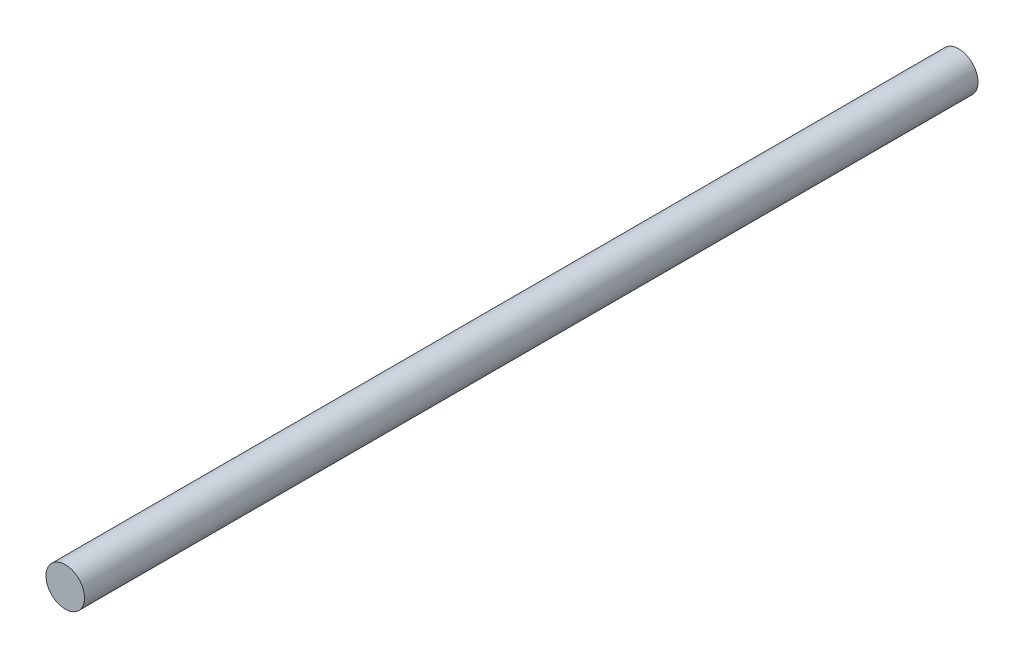
ISO-10303-21;
HEADER;
FILE_DESCRIPTION(('STEP AP214'),'2;1');
FILE_NAME('part.step','',(''),(''),'','','');
FILE_SCHEMA(('AUTOMOTIVE_DESIGN { 1 0 10303 214 1 1 1 1 }'));
ENDSEC;
DATA;
#1=APPLICATION_CONTEXT('core data for automotive mechanical design processes');
#2=APPLICATION_PROTOCOL_DEFINITION('international standard','automotive_design',2000,#1);
#3=PRODUCT_CONTEXT('',#1,'mechanical');
#4=PRODUCT('Part','Part','',(#3));
#5=PRODUCT_RELATED_PRODUCT_CATEGORY('part','',(#4));
#6=PRODUCT_DEFINITION_FORMATION('','',#4);
#7=PRODUCT_DEFINITION_CONTEXT('part definition',#1,'design');
#8=PRODUCT_DEFINITION('design','',#6,#7);
#9=PRODUCT_DEFINITION_SHAPE('','',#8);
#10=(LENGTH_UNIT() NAMED_UNIT(*) SI_UNIT(.MILLI.,.METRE.));
#11=(NAMED_UNIT(*) PLANE_ANGLE_UNIT() SI_UNIT($,.RADIAN.));
#12=(NAMED_UNIT(*) SI_UNIT($,.STERADIAN.) SOLID_ANGLE_UNIT());
#13=UNCERTAINTY_MEASURE_WITH_UNIT(LENGTH_MEASURE(1.E-05),#10,'distance_accuracy_value','');
#14=(GEOMETRIC_REPRESENTATION_CONTEXT(3) GLOBAL_UNCERTAINTY_ASSIGNED_CONTEXT((#13)) GLOBAL_UNIT_ASSIGNED_CONTEXT((#10,
#11,#12)) REPRESENTATION_CONTEXT('',''));
#15=CARTESIAN_POINT('',(0.,0.,0.));
#16=DIRECTION('',(0.,0.,1.));
#17=DIRECTION('',(1.,0.,0.));
#18=AXIS2_PLACEMENT_3D('',#15,#16,#17);
#19=CARTESIAN_POINT('',(0.,0.,139.));
#20=DIRECTION('',(0.,0.,-1.));
#21=DIRECTION('',(-1.,0.,0.));
#22=AXIS2_PLACEMENT_3D('',#19,#20,#21);
#23=CYLINDRICAL_SURFACE('',#22,3.);
#24=CARTESIAN_POINT('',(0.,0.,139.));
#25=DIRECTION('',(0.,0.,1.));
#26=DIRECTION('',(1.,0.,0.));
#27=AXIS2_PLACEMENT_3D('',#24,#25,#26);
#28=CIRCLE('',#27,3.);
#29=CARTESIAN_POINT('',(3.,0.,139.));
#30=VERTEX_POINT('',#29);
#31=EDGE_CURVE('E10',#30,#30,#28,.T.);
#32=ORIENTED_EDGE('',*,*,#31,.F.);
#33=EDGE_LOOP('',(#32));
#34=FACE_BOUND('',#33,.T.);
#35=CARTESIAN_POINT('',(0.,0.,0.));
#36=DIRECTION('',(0.,0.,1.));
#37=DIRECTION('',(1.,0.,0.));
#38=AXIS2_PLACEMENT_3D('',#35,#36,#37);
#39=CIRCLE('',#38,3.);
#40=CARTESIAN_POINT('',(3.,0.,0.));
#41=VERTEX_POINT('',#40);
#42=EDGE_CURVE('E38',#41,#41,#39,.T.);
#43=ORIENTED_EDGE('',*,*,#42,.T.);
#44=EDGE_LOOP('',(#43));
#45=FACE_BOUND('',#44,.T.);
#46=ADVANCED_FACE('F35',(#34,#45),#23,.T.);
#47=CARTESIAN_POINT('',(0.,0.,139.));
#48=DIRECTION('',(0.,0.,1.));
#49=DIRECTION('',(1.,0.,0.));
#50=AXIS2_PLACEMENT_3D('',#47,#48,#49);
#51=PLANE('',#50);
#52=ORIENTED_EDGE('',*,*,#31,.T.);
#53=EDGE_LOOP('',(#52));
#54=FACE_BOUND('',#53,.T.);
#55=ADVANCED_FACE('F50',(#54),#51,.T.);
#56=CARTESIAN_POINT('',(0.,0.,0.));
#57=DIRECTION('',(0.,0.,1.));
#58=DIRECTION('',(1.,0.,0.));
#59=AXIS2_PLACEMENT_3D('',#56,#57,#58);
#60=PLANE('',#59);
#61=ORIENTED_EDGE('',*,*,#42,.F.);
#62=EDGE_LOOP('',(#61));
#63=FACE_BOUND('',#62,.T.);
#64=ADVANCED_FACE('F48',(#63),#60,.F.);
#65=CLOSED_SHELL('',(#46,#55,#64));
#66=MANIFOLD_SOLID_BREP('B2',#65);
#67=ADVANCED_BREP_SHAPE_REPRESENTATION('',(#18,#66),#14);
#68=SHAPE_DEFINITION_REPRESENTATION(#9,#67);
ENDSEC;
END-ISO-10303-21;
